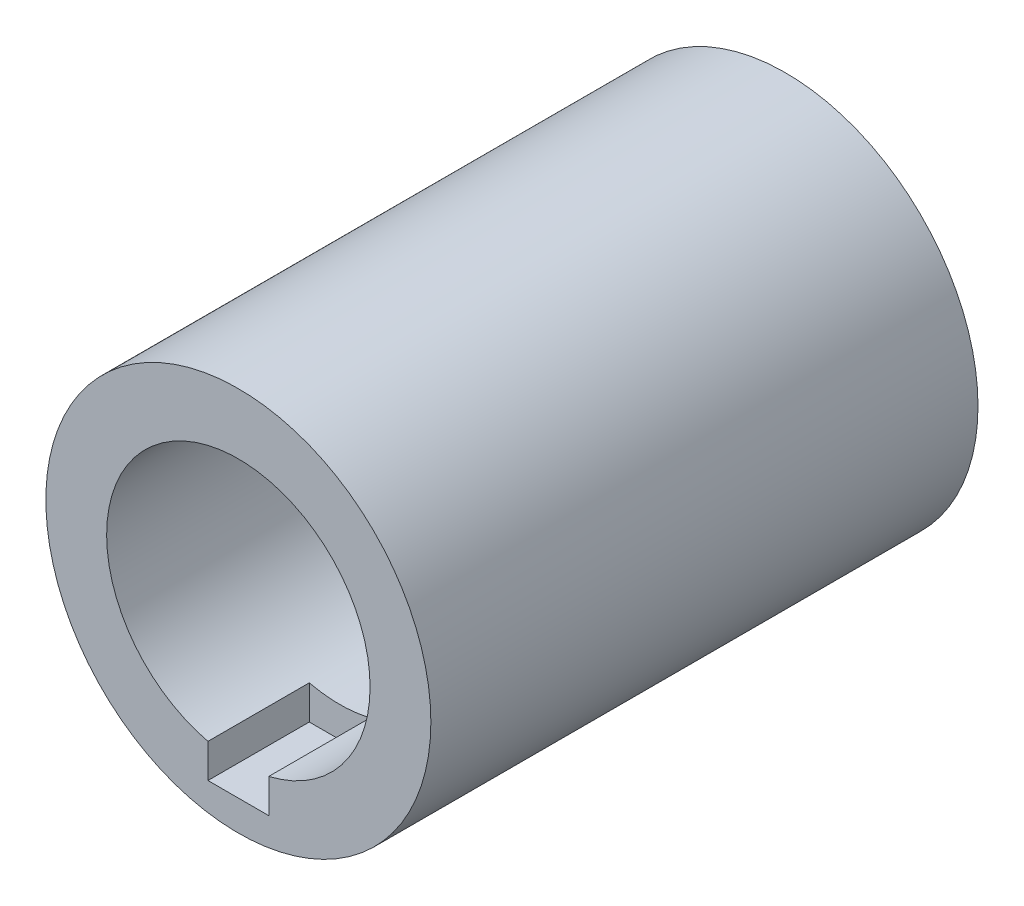
ISO-10303-21;
HEADER;
FILE_DESCRIPTION(('STEP AP214'),'2;1');
FILE_NAME('part.step','',(''),(''),'','','');
FILE_SCHEMA(('AUTOMOTIVE_DESIGN { 1 0 10303 214 1 1 1 1 }'));
ENDSEC;
DATA;
#1=APPLICATION_CONTEXT('core data for automotive mechanical design processes');
#2=APPLICATION_PROTOCOL_DEFINITION('international standard','automotive_design',2000,#1);
#3=PRODUCT_CONTEXT('',#1,'mechanical');
#4=PRODUCT('Part','Part','',(#3));
#5=PRODUCT_RELATED_PRODUCT_CATEGORY('part','',(#4));
#6=PRODUCT_DEFINITION_FORMATION('','',#4);
#7=PRODUCT_DEFINITION_CONTEXT('part definition',#1,'design');
#8=PRODUCT_DEFINITION('design','',#6,#7);
#9=PRODUCT_DEFINITION_SHAPE('','',#8);
#10=(LENGTH_UNIT() NAMED_UNIT(*) SI_UNIT(.MILLI.,.METRE.));
#11=(NAMED_UNIT(*) PLANE_ANGLE_UNIT() SI_UNIT($,.RADIAN.));
#12=(NAMED_UNIT(*) SI_UNIT($,.STERADIAN.) SOLID_ANGLE_UNIT());
#13=UNCERTAINTY_MEASURE_WITH_UNIT(LENGTH_MEASURE(1.E-05),#10,'distance_accuracy_value','');
#14=(GEOMETRIC_REPRESENTATION_CONTEXT(3) GLOBAL_UNCERTAINTY_ASSIGNED_CONTEXT((#13)) GLOBAL_UNIT_ASSIGNED_CONTEXT((#10,
#11,#12)) REPRESENTATION_CONTEXT('',''));
#15=CARTESIAN_POINT('',(0.,0.,0.));
#16=DIRECTION('',(0.,0.,1.));
#17=DIRECTION('',(1.,0.,0.));
#18=AXIS2_PLACEMENT_3D('',#15,#16,#17);
#19=CARTESIAN_POINT('',(0.,0.,13.5));
#20=DIRECTION('',(0.,0.,-1.));
#21=DIRECTION('',(-1.,0.,0.));
#22=AXIS2_PLACEMENT_3D('',#19,#20,#21);
#23=CYLINDRICAL_SURFACE('',#22,6.5);
#24=CARTESIAN_POINT('',(0.,0.,-13.5));
#25=DIRECTION('',(0.,0.,1.));
#26=DIRECTION('',(1.,0.,0.));
#27=AXIS2_PLACEMENT_3D('',#24,#25,#26);
#28=CIRCLE('',#27,6.5);
#29=CARTESIAN_POINT('',(6.5,0.,-13.5));
#30=VERTEX_POINT('',#29);
#31=EDGE_CURVE('E98',#30,#30,#28,.T.);
#32=ORIENTED_EDGE('',*,*,#31,.F.);
#33=EDGE_LOOP('',(#32));
#34=FACE_BOUND('',#33,.T.);
#35=CARTESIAN_POINT('',(0.,0.,8.5));
#36=DIRECTION('',(0.,0.,1.));
#37=DIRECTION('',(1.,0.,0.));
#38=AXIS2_PLACEMENT_3D('',#35,#36,#37);
#39=CIRCLE('',#38,6.5);
#40=CARTESIAN_POINT('',(1.5,-6.32455532033676,8.5));
#41=VERTEX_POINT('',#40);
#42=CARTESIAN_POINT('',(-1.5,-6.32455532033676,8.5));
#43=VERTEX_POINT('',#42);
#44=EDGE_CURVE('E83',#41,#43,#39,.F.);
#45=ORIENTED_EDGE('',*,*,#44,.F.);
#46=DIRECTION('',(0.,0.,-1.));
#47=VECTOR('',#46,1.);
#48=CARTESIAN_POINT('',(1.5,-6.32455532033676,13.5));
#49=LINE('',#48,#47);
#50=CARTESIAN_POINT('',(1.5,-6.32455532033676,13.5));
#51=VERTEX_POINT('',#50);
#52=EDGE_CURVE('E89',#51,#41,#49,.T.);
#53=ORIENTED_EDGE('',*,*,#52,.F.);
#54=CARTESIAN_POINT('',(0.,0.,13.5));
#55=DIRECTION('',(0.,0.,1.));
#56=DIRECTION('',(1.,0.,0.));
#57=AXIS2_PLACEMENT_3D('',#54,#55,#56);
#58=CIRCLE('',#57,6.5);
#59=CARTESIAN_POINT('',(-1.5,-6.32455532033676,13.5));
#60=VERTEX_POINT('',#59);
#61=EDGE_CURVE('E43',#51,#60,#58,.T.);
#62=ORIENTED_EDGE('',*,*,#61,.T.);
#63=DIRECTION('',(0.,0.,-1.));
#64=VECTOR('',#63,1.);
#65=CARTESIAN_POINT('',(-1.5,-6.32455532033676,13.5));
#66=LINE('',#65,#64);
#67=EDGE_CURVE('E96',#43,#60,#66,.F.);
#68=ORIENTED_EDGE('',*,*,#67,.F.);
#69=EDGE_LOOP('',(#45,#53,#62,#68));
#70=FACE_BOUND('',#69,.T.);
#71=ADVANCED_FACE('F35',(#34,#70),#23,.F.);
#72=CARTESIAN_POINT('',(0.,0.,13.5));
#73=DIRECTION('',(0.,0.,1.));
#74=DIRECTION('',(1.,0.,0.));
#75=AXIS2_PLACEMENT_3D('',#72,#73,#74);
#76=PLANE('',#75);
#77=CARTESIAN_POINT('',(0.,0.,13.5));
#78=DIRECTION('',(0.,0.,1.));
#79=DIRECTION('',(1.,0.,0.));
#80=AXIS2_PLACEMENT_3D('',#77,#78,#79);
#81=CIRCLE('',#80,9.5);
#82=CARTESIAN_POINT('',(9.5,0.,13.5));
#83=VERTEX_POINT('',#82);
#84=EDGE_CURVE('E11',#83,#83,#81,.T.);
#85=ORIENTED_EDGE('',*,*,#84,.T.);
#86=EDGE_LOOP('',(#85));
#87=FACE_BOUND('',#86,.T.);
#88=ORIENTED_EDGE('',*,*,#61,.F.);
#89=DIRECTION('',(0.,-1.,0.));
#90=VECTOR('',#89,1.);
#91=CARTESIAN_POINT('',(1.5,9.501,13.5));
#92=LINE('',#91,#90);
#93=CARTESIAN_POINT('',(1.5,-8.,13.5));
#94=VERTEX_POINT('',#93);
#95=EDGE_CURVE('E59',#51,#94,#92,.T.);
#96=ORIENTED_EDGE('',*,*,#95,.T.);
#97=DIRECTION('',(1.,0.,0.));
#98=VECTOR('',#97,1.);
#99=CARTESIAN_POINT('',(-1.5,-8.,13.5));
#100=LINE('',#99,#98);
#101=CARTESIAN_POINT('',(-1.5,-8.,13.5));
#102=VERTEX_POINT('',#101);
#103=EDGE_CURVE('E94',#102,#94,#100,.T.);
#104=ORIENTED_EDGE('',*,*,#103,.F.);
#105=DIRECTION('',(0.,-1.,0.));
#106=VECTOR('',#105,1.);
#107=CARTESIAN_POINT('',(-1.5,9.501,13.5));
#108=LINE('',#107,#106);
#109=EDGE_CURVE('E148',#60,#102,#108,.T.);
#110=ORIENTED_EDGE('',*,*,#109,.F.);
#111=EDGE_LOOP('',(#88,#96,#104,#110));
#112=FACE_BOUND('',#111,.T.);
#113=ADVANCED_FACE('F119',(#87,#112),#76,.T.);
#114=CARTESIAN_POINT('',(0.,0.,13.5));
#115=DIRECTION('',(0.,0.,-1.));
#116=DIRECTION('',(-1.,0.,0.));
#117=AXIS2_PLACEMENT_3D('',#114,#115,#116);
#118=CYLINDRICAL_SURFACE('',#117,9.5);
#119=ORIENTED_EDGE('',*,*,#84,.F.);
#120=EDGE_LOOP('',(#119));
#121=FACE_BOUND('',#120,.T.);
#122=CARTESIAN_POINT('',(0.,0.,-13.5));
#123=DIRECTION('',(0.,0.,1.));
#124=DIRECTION('',(1.,0.,0.));
#125=AXIS2_PLACEMENT_3D('',#122,#123,#124);
#126=CIRCLE('',#125,9.5);
#127=CARTESIAN_POINT('',(9.5,0.,-13.5));
#128=VERTEX_POINT('',#127);
#129=EDGE_CURVE('E38',#128,#128,#126,.T.);
#130=ORIENTED_EDGE('',*,*,#129,.T.);
#131=EDGE_LOOP('',(#130));
#132=FACE_BOUND('',#131,.T.);
#133=ADVANCED_FACE('F109',(#121,#132),#118,.T.);
#134=CARTESIAN_POINT('',(0.,0.,-13.5));
#135=DIRECTION('',(0.,0.,1.));
#136=DIRECTION('',(1.,0.,0.));
#137=AXIS2_PLACEMENT_3D('',#134,#135,#136);
#138=PLANE('',#137);
#139=ORIENTED_EDGE('',*,*,#31,.T.);
#140=EDGE_LOOP('',(#139));
#141=FACE_BOUND('',#140,.T.);
#142=ORIENTED_EDGE('',*,*,#129,.F.);
#143=EDGE_LOOP('',(#142));
#144=FACE_BOUND('',#143,.T.);
#145=ADVANCED_FACE('F111',(#141,#144),#138,.F.);
#146=CARTESIAN_POINT('',(1.5,9.501,8.5));
#147=DIRECTION('',(-1.,0.,0.));
#148=DIRECTION('',(0.,0.,1.));
#149=AXIS2_PLACEMENT_3D('',#146,#147,#148);
#150=PLANE('',#149);
#151=ORIENTED_EDGE('',*,*,#52,.T.);
#152=DIRECTION('',(0.,-1.,0.));
#153=VECTOR('',#152,1.);
#154=CARTESIAN_POINT('',(1.5,9.501,8.5));
#155=LINE('',#154,#153);
#156=CARTESIAN_POINT('',(1.5,-8.,8.5));
#157=VERTEX_POINT('',#156);
#158=EDGE_CURVE('E80',#41,#157,#155,.T.);
#159=ORIENTED_EDGE('',*,*,#158,.T.);
#160=DIRECTION('',(0.,0.,-1.));
#161=VECTOR('',#160,1.);
#162=CARTESIAN_POINT('',(1.5,-8.,8.5));
#163=LINE('',#162,#161);
#164=EDGE_CURVE('E87',#94,#157,#163,.T.);
#165=ORIENTED_EDGE('',*,*,#164,.F.);
#166=ORIENTED_EDGE('',*,*,#95,.F.);
#167=EDGE_LOOP('',(#151,#159,#165,#166));
#168=FACE_BOUND('',#167,.T.);
#169=ADVANCED_FACE('F90',(#168),#150,.T.);
#170=CARTESIAN_POINT('',(-1.5,9.501,8.5));
#171=DIRECTION('',(0.,0.,1.));
#172=DIRECTION('',(1.,0.,0.));
#173=AXIS2_PLACEMENT_3D('',#170,#171,#172);
#174=PLANE('',#173);
#175=ORIENTED_EDGE('',*,*,#44,.T.);
#176=DIRECTION('',(0.,-1.,0.));
#177=VECTOR('',#176,1.);
#178=CARTESIAN_POINT('',(-1.5,9.501,8.5));
#179=LINE('',#178,#177);
#180=CARTESIAN_POINT('',(-1.5,-8.,8.5));
#181=VERTEX_POINT('',#180);
#182=EDGE_CURVE('E147',#43,#181,#179,.T.);
#183=ORIENTED_EDGE('',*,*,#182,.T.);
#184=DIRECTION('',(-1.,0.,0.));
#185=VECTOR('',#184,1.);
#186=CARTESIAN_POINT('',(-1.5,-8.,8.5));
#187=LINE('',#186,#185);
#188=EDGE_CURVE('E85',#157,#181,#187,.T.);
#189=ORIENTED_EDGE('',*,*,#188,.F.);
#190=ORIENTED_EDGE('',*,*,#158,.F.);
#191=EDGE_LOOP('',(#175,#183,#189,#190));
#192=FACE_BOUND('',#191,.T.);
#193=ADVANCED_FACE('F81',(#192),#174,.T.);
#194=CARTESIAN_POINT('',(-1.5,9.501,8.5));
#195=DIRECTION('',(1.,0.,0.));
#196=DIRECTION('',(0.,0.,-1.));
#197=AXIS2_PLACEMENT_3D('',#194,#195,#196);
#198=PLANE('',#197);
#199=ORIENTED_EDGE('',*,*,#67,.T.);
#200=ORIENTED_EDGE('',*,*,#109,.T.);
#201=DIRECTION('',(0.,0.,1.));
#202=VECTOR('',#201,1.);
#203=CARTESIAN_POINT('',(-1.5,-8.,8.5));
#204=LINE('',#203,#202);
#205=EDGE_CURVE('E51',#181,#102,#204,.T.);
#206=ORIENTED_EDGE('',*,*,#205,.F.);
#207=ORIENTED_EDGE('',*,*,#182,.F.);
#208=EDGE_LOOP('',(#199,#200,#206,#207));
#209=FACE_BOUND('',#208,.T.);
#210=ADVANCED_FACE('F134',(#209),#198,.T.);
#211=CARTESIAN_POINT('',(0.,-8.,0.));
#212=DIRECTION('',(0.,1.,0.));
#213=DIRECTION('',(0.,0.,1.));
#214=AXIS2_PLACEMENT_3D('',#211,#212,#213);
#215=PLANE('',#214);
#216=ORIENTED_EDGE('',*,*,#164,.T.);
#217=ORIENTED_EDGE('',*,*,#188,.T.);
#218=ORIENTED_EDGE('',*,*,#205,.T.);
#219=ORIENTED_EDGE('',*,*,#103,.T.);
#220=EDGE_LOOP('',(#216,#217,#218,#219));
#221=FACE_BOUND('',#220,.T.);
#222=ADVANCED_FACE('F137',(#221),#215,.T.);
#223=CLOSED_SHELL('',(#71,#113,#133,#145,#169,#193,#210,#222));
#224=MANIFOLD_SOLID_BREP('B2',#223);
#225=ADVANCED_BREP_SHAPE_REPRESENTATION('',(#18,#224),#14);
#226=SHAPE_DEFINITION_REPRESENTATION(#9,#225);
ENDSEC;
END-ISO-10303-21;
